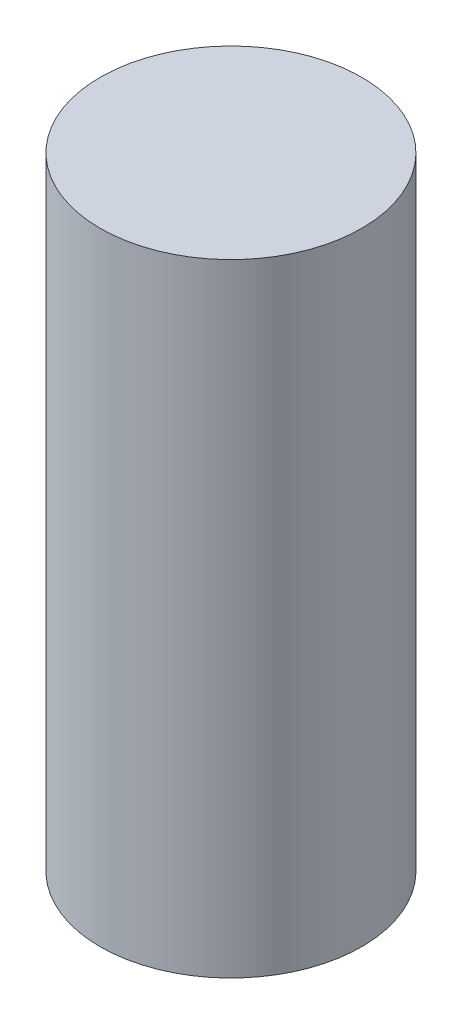
ISO-10303-21;
HEADER;
FILE_DESCRIPTION(('STEP AP214'),'2;1');
FILE_NAME('part.step','',(''),(''),'','','');
FILE_SCHEMA(('AUTOMOTIVE_DESIGN { 1 0 10303 214 1 1 1 1 }'));
ENDSEC;
DATA;
#1=APPLICATION_CONTEXT('core data for automotive mechanical design processes');
#2=APPLICATION_PROTOCOL_DEFINITION('international standard','automotive_design',2000,#1);
#3=PRODUCT_CONTEXT('',#1,'mechanical');
#4=PRODUCT('Part','Part','',(#3));
#5=PRODUCT_RELATED_PRODUCT_CATEGORY('part','',(#4));
#6=PRODUCT_DEFINITION_FORMATION('','',#4);
#7=PRODUCT_DEFINITION_CONTEXT('part definition',#1,'design');
#8=PRODUCT_DEFINITION('design','',#6,#7);
#9=PRODUCT_DEFINITION_SHAPE('','',#8);
#10=(LENGTH_UNIT() NAMED_UNIT(*) SI_UNIT(.MILLI.,.METRE.));
#11=(NAMED_UNIT(*) PLANE_ANGLE_UNIT() SI_UNIT($,.RADIAN.));
#12=(NAMED_UNIT(*) SI_UNIT($,.STERADIAN.) SOLID_ANGLE_UNIT());
#13=UNCERTAINTY_MEASURE_WITH_UNIT(LENGTH_MEASURE(1.E-05),#10,'distance_accuracy_value','');
#14=(GEOMETRIC_REPRESENTATION_CONTEXT(3) GLOBAL_UNCERTAINTY_ASSIGNED_CONTEXT((#13)) GLOBAL_UNIT_ASSIGNED_CONTEXT((#10,
#11,#12)) REPRESENTATION_CONTEXT('',''));
#15=CARTESIAN_POINT('',(0.,0.,0.));
#16=DIRECTION('',(0.,0.,1.));
#17=DIRECTION('',(1.,0.,0.));
#18=AXIS2_PLACEMENT_3D('',#15,#16,#17);
#19=CARTESIAN_POINT('',(0.,50.8,0.));
#20=DIRECTION('',(0.,-1.,0.));
#21=DIRECTION('',(0.,0.,-1.));
#22=AXIS2_PLACEMENT_3D('',#19,#20,#21);
#23=CYLINDRICAL_SURFACE('',#22,10.6807);
#24=CARTESIAN_POINT('',(0.,50.8,0.));
#25=DIRECTION('',(0.,1.,0.));
#26=DIRECTION('',(0.,0.,1.));
#27=AXIS2_PLACEMENT_3D('',#24,#25,#26);
#28=CIRCLE('',#27,10.6807);
#29=CARTESIAN_POINT('',(0.,50.8,10.6807));
#30=VERTEX_POINT('',#29);
#31=EDGE_CURVE('E10',#30,#30,#28,.T.);
#32=ORIENTED_EDGE('',*,*,#31,.F.);
#33=EDGE_LOOP('',(#32));
#34=FACE_BOUND('',#33,.T.);
#35=CARTESIAN_POINT('',(0.,0.,0.));
#36=DIRECTION('',(0.,1.,0.));
#37=DIRECTION('',(0.,0.,1.));
#38=AXIS2_PLACEMENT_3D('',#35,#36,#37);
#39=CIRCLE('',#38,10.6807);
#40=CARTESIAN_POINT('',(0.,0.,10.6807));
#41=VERTEX_POINT('',#40);
#42=EDGE_CURVE('E34',#41,#41,#39,.T.);
#43=ORIENTED_EDGE('',*,*,#42,.T.);
#44=EDGE_LOOP('',(#43));
#45=FACE_BOUND('',#44,.T.);
#46=ADVANCED_FACE('F31',(#34,#45),#23,.T.);
#47=CARTESIAN_POINT('',(0.,50.8,0.));
#48=DIRECTION('',(0.,1.,0.));
#49=DIRECTION('',(0.,0.,1.));
#50=AXIS2_PLACEMENT_3D('',#47,#48,#49);
#51=PLANE('',#50);
#52=ORIENTED_EDGE('',*,*,#31,.T.);
#53=EDGE_LOOP('',(#52));
#54=FACE_BOUND('',#53,.T.);
#55=ADVANCED_FACE('F46',(#54),#51,.T.);
#56=CARTESIAN_POINT('',(0.,0.,0.));
#57=DIRECTION('',(0.,1.,0.));
#58=DIRECTION('',(0.,0.,1.));
#59=AXIS2_PLACEMENT_3D('',#56,#57,#58);
#60=PLANE('',#59);
#61=ORIENTED_EDGE('',*,*,#42,.F.);
#62=EDGE_LOOP('',(#61));
#63=FACE_BOUND('',#62,.T.);
#64=ADVANCED_FACE('F44',(#63),#60,.F.);
#65=CLOSED_SHELL('',(#46,#55,#64));
#66=MANIFOLD_SOLID_BREP('B2',#65);
#67=ADVANCED_BREP_SHAPE_REPRESENTATION('',(#18,#66),#14);
#68=SHAPE_DEFINITION_REPRESENTATION(#9,#67);
ENDSEC;
END-ISO-10303-21;
